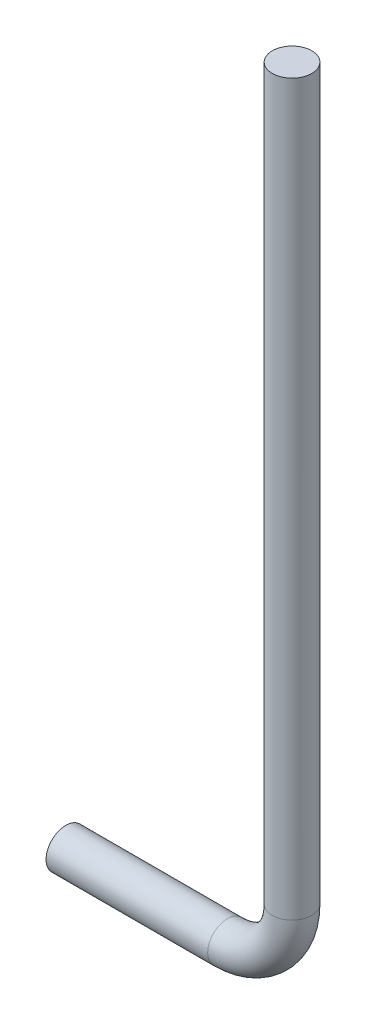
ISO-10303-21;
HEADER;
FILE_DESCRIPTION(('STEP AP214'),'2;1');
FILE_NAME('part.step','',(''),(''),'','','');
FILE_SCHEMA(('AUTOMOTIVE_DESIGN { 1 0 10303 214 1 1 1 1 }'));
ENDSEC;
DATA;
#1=APPLICATION_CONTEXT('core data for automotive mechanical design processes');
#2=APPLICATION_PROTOCOL_DEFINITION('international standard','automotive_design',2000,#1);
#3=PRODUCT_CONTEXT('',#1,'mechanical');
#4=PRODUCT('Part','Part','',(#3));
#5=PRODUCT_RELATED_PRODUCT_CATEGORY('part','',(#4));
#6=PRODUCT_DEFINITION_FORMATION('','',#4);
#7=PRODUCT_DEFINITION_CONTEXT('part definition',#1,'design');
#8=PRODUCT_DEFINITION('design','',#6,#7);
#9=PRODUCT_DEFINITION_SHAPE('','',#8);
#10=(LENGTH_UNIT() NAMED_UNIT(*) SI_UNIT(.MILLI.,.METRE.));
#11=(NAMED_UNIT(*) PLANE_ANGLE_UNIT() SI_UNIT($,.RADIAN.));
#12=(NAMED_UNIT(*) SI_UNIT($,.STERADIAN.) SOLID_ANGLE_UNIT());
#13=UNCERTAINTY_MEASURE_WITH_UNIT(LENGTH_MEASURE(1.E-05),#10,'distance_accuracy_value','');
#14=(GEOMETRIC_REPRESENTATION_CONTEXT(3) GLOBAL_UNCERTAINTY_ASSIGNED_CONTEXT((#13)) GLOBAL_UNIT_ASSIGNED_CONTEXT((#10,
#11,#12)) REPRESENTATION_CONTEXT('',''));
#15=CARTESIAN_POINT('',(0.,0.,0.));
#16=DIRECTION('',(0.,0.,1.));
#17=DIRECTION('',(1.,0.,0.));
#18=AXIS2_PLACEMENT_3D('',#15,#16,#17);
#19=CARTESIAN_POINT('',(25.,-24.5,-5.));
#20=DIRECTION('',(-1.,0.,0.));
#21=DIRECTION('',(0.,0.,1.));
#22=AXIS2_PLACEMENT_3D('',#19,#20,#21);
#23=CYLINDRICAL_SURFACE('',#22,3.05);
#24=CARTESIAN_POINT('',(25.,-24.5,-5.));
#25=DIRECTION('',(1.,0.,0.));
#26=DIRECTION('',(0.,0.,1.));
#27=AXIS2_PLACEMENT_3D('',#24,#25,#26);
#28=CIRCLE('',#27,3.05);
#29=CARTESIAN_POINT('',(25.,-27.55,-5.));
#30=VERTEX_POINT('',#29);
#31=EDGE_CURVE('E37',#30,#30,#28,.T.);
#32=ORIENTED_EDGE('',*,*,#31,.F.);
#33=EDGE_LOOP('',(#32));
#34=FACE_BOUND('',#33,.T.);
#35=CARTESIAN_POINT('',(0.,-24.5,-5.));
#36=DIRECTION('',(1.,0.,0.));
#37=DIRECTION('',(0.,0.,1.));
#38=AXIS2_PLACEMENT_3D('',#35,#36,#37);
#39=CIRCLE('',#38,3.05);
#40=CARTESIAN_POINT('',(0.,-24.5,-1.95));
#41=VERTEX_POINT('',#40);
#42=EDGE_CURVE('E10',#41,#41,#39,.T.);
#43=ORIENTED_EDGE('',*,*,#42,.T.);
#44=EDGE_LOOP('',(#43));
#45=FACE_BOUND('',#44,.T.);
#46=ADVANCED_FACE('F31',(#34,#45),#23,.T.);
#47=CARTESIAN_POINT('',(25.,-14.5,-5.));
#48=DIRECTION('',(0.,0.,-1.));
#49=DIRECTION('',(-1.,0.,0.));
#50=AXIS2_PLACEMENT_3D('',#47,#48,#49);
#51=TOROIDAL_SURFACE('',#50,10.,3.05);
#52=CARTESIAN_POINT('',(35.,-14.5,-5.));
#53=DIRECTION('',(0.,1.,0.));
#54=DIRECTION('',(0.,0.,1.));
#55=AXIS2_PLACEMENT_3D('',#52,#53,#54);
#56=CIRCLE('',#55,3.05);
#57=CARTESIAN_POINT('',(38.05,-14.5,-5.));
#58=VERTEX_POINT('',#57);
#59=EDGE_CURVE('E41',#58,#58,#56,.T.);
#60=CARTESIAN_POINT('',(25.,-14.5,-5.));
#61=DIRECTION('',(0.,0.,-1.));
#62=DIRECTION('',(-1.,0.,0.));
#63=AXIS2_PLACEMENT_3D('',#60,#61,#62);
#64=CIRCLE('',#63,13.05);
#65=EDGE_CURVE('',#58,#30,#64,.T.);
#66=ORIENTED_EDGE('',*,*,#59,.F.);
#67=ORIENTED_EDGE('',*,*,#31,.T.);
#68=ORIENTED_EDGE('',*,*,#65,.T.);
#69=ORIENTED_EDGE('',*,*,#65,.F.);
#70=EDGE_LOOP('',(#66,#68,#67,#69));
#71=FACE_BOUND('',#70,.T.);
#72=ADVANCED_FACE('F56',(#71),#51,.T.);
#73=CARTESIAN_POINT('',(35.,-14.5,-5.));
#74=DIRECTION('',(0.,1.,0.));
#75=DIRECTION('',(0.,0.,1.));
#76=AXIS2_PLACEMENT_3D('',#73,#74,#75);
#77=CYLINDRICAL_SURFACE('',#76,3.05);
#78=ORIENTED_EDGE('',*,*,#59,.T.);
#79=EDGE_LOOP('',(#78));
#80=FACE_BOUND('',#79,.T.);
#81=CARTESIAN_POINT('',(35.,98.3,-5.));
#82=DIRECTION('',(0.,1.,0.));
#83=DIRECTION('',(0.,0.,1.));
#84=AXIS2_PLACEMENT_3D('',#81,#82,#83);
#85=CIRCLE('',#84,3.05);
#86=CARTESIAN_POINT('',(35.,98.3,-1.95));
#87=VERTEX_POINT('',#86);
#88=EDGE_CURVE('E45',#87,#87,#85,.T.);
#89=ORIENTED_EDGE('',*,*,#88,.F.);
#90=EDGE_LOOP('',(#89));
#91=FACE_BOUND('',#90,.T.);
#92=ADVANCED_FACE('F53',(#80,#91),#77,.T.);
#93=CARTESIAN_POINT('',(0.,-24.5,-5.));
#94=DIRECTION('',(1.,0.,0.));
#95=DIRECTION('',(0.,0.,1.));
#96=AXIS2_PLACEMENT_3D('',#93,#94,#95);
#97=PLANE('',#96);
#98=ORIENTED_EDGE('',*,*,#42,.F.);
#99=EDGE_LOOP('',(#98));
#100=FACE_BOUND('',#99,.T.);
#101=ADVANCED_FACE('F55',(#100),#97,.F.);
#102=CARTESIAN_POINT('',(35.,98.3,-5.));
#103=DIRECTION('',(0.,1.,0.));
#104=DIRECTION('',(0.,0.,1.));
#105=AXIS2_PLACEMENT_3D('',#102,#103,#104);
#106=PLANE('',#105);
#107=ORIENTED_EDGE('',*,*,#88,.T.);
#108=EDGE_LOOP('',(#107));
#109=FACE_BOUND('',#108,.T.);
#110=ADVANCED_FACE('F51',(#109),#106,.T.);
#111=CLOSED_SHELL('',(#46,#72,#92,#101,#110));
#112=MANIFOLD_SOLID_BREP('B2',#111);
#113=ADVANCED_BREP_SHAPE_REPRESENTATION('',(#18,#112),#14);
#114=SHAPE_DEFINITION_REPRESENTATION(#9,#113);
ENDSEC;
END-ISO-10303-21;
